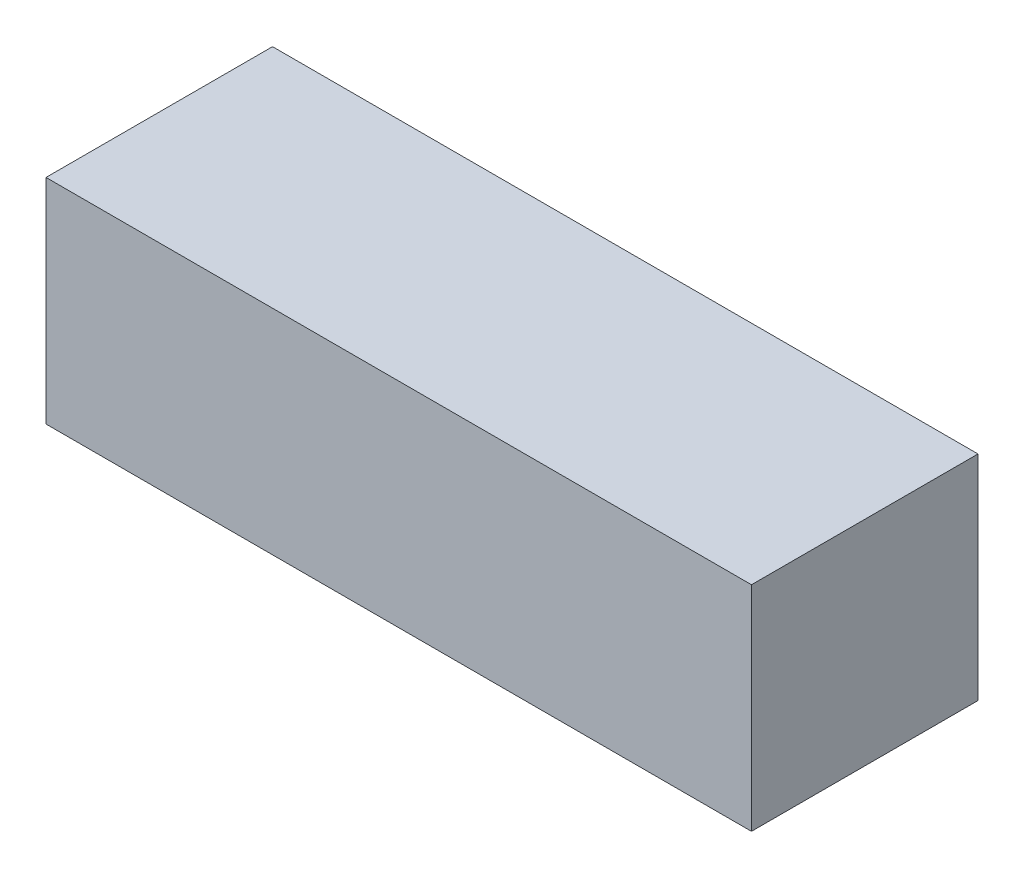
ISO-10303-21;
HEADER;
FILE_DESCRIPTION(('STEP AP214'),'2;1');
FILE_NAME('part.step','',(''),(''),'','','');
FILE_SCHEMA(('AUTOMOTIVE_DESIGN { 1 0 10303 214 1 1 1 1 }'));
ENDSEC;
DATA;
#1=APPLICATION_CONTEXT('core data for automotive mechanical design processes');
#2=APPLICATION_PROTOCOL_DEFINITION('international standard','automotive_design',2000,#1);
#3=PRODUCT_CONTEXT('',#1,'mechanical');
#4=PRODUCT('Part','Part','',(#3));
#5=PRODUCT_RELATED_PRODUCT_CATEGORY('part','',(#4));
#6=PRODUCT_DEFINITION_FORMATION('','',#4);
#7=PRODUCT_DEFINITION_CONTEXT('part definition',#1,'design');
#8=PRODUCT_DEFINITION('design','',#6,#7);
#9=PRODUCT_DEFINITION_SHAPE('','',#8);
#10=(LENGTH_UNIT() NAMED_UNIT(*) SI_UNIT(.MILLI.,.METRE.));
#11=(NAMED_UNIT(*) PLANE_ANGLE_UNIT() SI_UNIT($,.RADIAN.));
#12=(NAMED_UNIT(*) SI_UNIT($,.STERADIAN.) SOLID_ANGLE_UNIT());
#13=UNCERTAINTY_MEASURE_WITH_UNIT(LENGTH_MEASURE(1.E-05),#10,'distance_accuracy_value','');
#14=(GEOMETRIC_REPRESENTATION_CONTEXT(3) GLOBAL_UNCERTAINTY_ASSIGNED_CONTEXT((#13)) GLOBAL_UNIT_ASSIGNED_CONTEXT((#10,
#11,#12)) REPRESENTATION_CONTEXT('',''));
#15=CARTESIAN_POINT('',(0.,0.,0.));
#16=DIRECTION('',(0.,0.,1.));
#17=DIRECTION('',(1.,0.,0.));
#18=AXIS2_PLACEMENT_3D('',#15,#16,#17);
#19=CARTESIAN_POINT('',(54.5,16.5,-17.5));
#20=DIRECTION('',(-1.,0.,0.));
#21=DIRECTION('',(0.,0.,1.));
#22=AXIS2_PLACEMENT_3D('',#19,#20,#21);
#23=PLANE('',#22);
#24=DIRECTION('',(0.,0.,-1.));
#25=VECTOR('',#24,1.);
#26=CARTESIAN_POINT('',(54.5,-16.5,-17.5));
#27=LINE('',#26,#25);
#28=CARTESIAN_POINT('',(54.5,-16.5,17.5));
#29=VERTEX_POINT('',#28);
#30=CARTESIAN_POINT('',(54.5,-16.5,-17.5));
#31=VERTEX_POINT('',#30);
#32=EDGE_CURVE('E95',#29,#31,#27,.T.);
#33=ORIENTED_EDGE('',*,*,#32,.T.);
#34=DIRECTION('',(0.,-1.,0.));
#35=VECTOR('',#34,1.);
#36=CARTESIAN_POINT('',(54.5,16.5,-17.5));
#37=LINE('',#36,#35);
#38=CARTESIAN_POINT('',(54.5,16.5,-17.5));
#39=VERTEX_POINT('',#38);
#40=EDGE_CURVE('E11',#39,#31,#37,.T.);
#41=ORIENTED_EDGE('',*,*,#40,.F.);
#42=DIRECTION('',(0.,0.,-1.));
#43=VECTOR('',#42,1.);
#44=CARTESIAN_POINT('',(54.5,16.5,-17.5));
#45=LINE('',#44,#43);
#46=CARTESIAN_POINT('',(54.5,16.5,17.5));
#47=VERTEX_POINT('',#46);
#48=EDGE_CURVE('E83',#47,#39,#45,.T.);
#49=ORIENTED_EDGE('',*,*,#48,.F.);
#50=DIRECTION('',(0.,-1.,0.));
#51=VECTOR('',#50,1.);
#52=CARTESIAN_POINT('',(54.5,16.5,17.5));
#53=LINE('',#52,#51);
#54=EDGE_CURVE('E91',#47,#29,#53,.T.);
#55=ORIENTED_EDGE('',*,*,#54,.T.);
#56=EDGE_LOOP('',(#33,#41,#49,#55));
#57=FACE_BOUND('',#56,.T.);
#58=ADVANCED_FACE('F32',(#57),#23,.F.);
#59=CARTESIAN_POINT('',(-54.5,16.5,-17.5));
#60=DIRECTION('',(0.,0.,1.));
#61=DIRECTION('',(1.,0.,0.));
#62=AXIS2_PLACEMENT_3D('',#59,#60,#61);
#63=PLANE('',#62);
#64=DIRECTION('',(-1.,0.,0.));
#65=VECTOR('',#64,1.);
#66=CARTESIAN_POINT('',(-54.5,-16.5,-17.5));
#67=LINE('',#66,#65);
#68=CARTESIAN_POINT('',(-54.5,-16.5,-17.5));
#69=VERTEX_POINT('',#68);
#70=EDGE_CURVE('E87',#31,#69,#67,.T.);
#71=ORIENTED_EDGE('',*,*,#70,.T.);
#72=DIRECTION('',(0.,-1.,0.));
#73=VECTOR('',#72,1.);
#74=CARTESIAN_POINT('',(-54.5,16.5,-17.5));
#75=LINE('',#74,#73);
#76=CARTESIAN_POINT('',(-54.5,16.5,-17.5));
#77=VERTEX_POINT('',#76);
#78=EDGE_CURVE('E40',#77,#69,#75,.T.);
#79=ORIENTED_EDGE('',*,*,#78,.F.);
#80=DIRECTION('',(-1.,0.,0.));
#81=VECTOR('',#80,1.);
#82=CARTESIAN_POINT('',(-54.5,16.5,-17.5));
#83=LINE('',#82,#81);
#84=EDGE_CURVE('E78',#39,#77,#83,.T.);
#85=ORIENTED_EDGE('',*,*,#84,.F.);
#86=ORIENTED_EDGE('',*,*,#40,.T.);
#87=EDGE_LOOP('',(#71,#79,#85,#86));
#88=FACE_BOUND('',#87,.T.);
#89=ADVANCED_FACE('F86',(#88),#63,.F.);
#90=CARTESIAN_POINT('',(-54.5,16.5,-17.5));
#91=DIRECTION('',(1.,0.,0.));
#92=DIRECTION('',(0.,0.,-1.));
#93=AXIS2_PLACEMENT_3D('',#90,#91,#92);
#94=PLANE('',#93);
#95=DIRECTION('',(0.,0.,1.));
#96=VECTOR('',#95,1.);
#97=CARTESIAN_POINT('',(-54.5,-16.5,-17.5));
#98=LINE('',#97,#96);
#99=CARTESIAN_POINT('',(-54.5,-16.5,17.5));
#100=VERTEX_POINT('',#99);
#101=EDGE_CURVE('E65',#69,#100,#98,.T.);
#102=ORIENTED_EDGE('',*,*,#101,.T.);
#103=DIRECTION('',(0.,-1.,0.));
#104=VECTOR('',#103,1.);
#105=CARTESIAN_POINT('',(-54.5,16.5,17.5));
#106=LINE('',#105,#104);
#107=CARTESIAN_POINT('',(-54.5,16.5,17.5));
#108=VERTEX_POINT('',#107);
#109=EDGE_CURVE('E88',#108,#100,#106,.T.);
#110=ORIENTED_EDGE('',*,*,#109,.F.);
#111=DIRECTION('',(0.,0.,1.));
#112=VECTOR('',#111,1.);
#113=CARTESIAN_POINT('',(-54.5,16.5,-17.5));
#114=LINE('',#113,#112);
#115=EDGE_CURVE('E81',#77,#108,#114,.T.);
#116=ORIENTED_EDGE('',*,*,#115,.F.);
#117=ORIENTED_EDGE('',*,*,#78,.T.);
#118=EDGE_LOOP('',(#102,#110,#116,#117));
#119=FACE_BOUND('',#118,.T.);
#120=ADVANCED_FACE('F89',(#119),#94,.F.);
#121=CARTESIAN_POINT('',(-54.5,16.5,17.5));
#122=DIRECTION('',(0.,0.,-1.));
#123=DIRECTION('',(-1.,0.,0.));
#124=AXIS2_PLACEMENT_3D('',#121,#122,#123);
#125=PLANE('',#124);
#126=DIRECTION('',(1.,0.,0.));
#127=VECTOR('',#126,1.);
#128=CARTESIAN_POINT('',(-54.5,-16.5,17.5));
#129=LINE('',#128,#127);
#130=EDGE_CURVE('E71',#100,#29,#129,.T.);
#131=ORIENTED_EDGE('',*,*,#130,.T.);
#132=ORIENTED_EDGE('',*,*,#54,.F.);
#133=DIRECTION('',(1.,0.,0.));
#134=VECTOR('',#133,1.);
#135=CARTESIAN_POINT('',(-54.5,16.5,17.5));
#136=LINE('',#135,#134);
#137=EDGE_CURVE('E48',#108,#47,#136,.T.);
#138=ORIENTED_EDGE('',*,*,#137,.F.);
#139=ORIENTED_EDGE('',*,*,#109,.T.);
#140=EDGE_LOOP('',(#131,#132,#138,#139));
#141=FACE_BOUND('',#140,.T.);
#142=ADVANCED_FACE('F102',(#141),#125,.F.);
#143=CARTESIAN_POINT('',(0.,16.5,0.));
#144=DIRECTION('',(0.,1.,0.));
#145=DIRECTION('',(0.,0.,1.));
#146=AXIS2_PLACEMENT_3D('',#143,#144,#145);
#147=PLANE('',#146);
#148=ORIENTED_EDGE('',*,*,#48,.T.);
#149=ORIENTED_EDGE('',*,*,#84,.T.);
#150=ORIENTED_EDGE('',*,*,#115,.T.);
#151=ORIENTED_EDGE('',*,*,#137,.T.);
#152=EDGE_LOOP('',(#148,#149,#150,#151));
#153=FACE_BOUND('',#152,.T.);
#154=ADVANCED_FACE('F79',(#153),#147,.T.);
#155=CARTESIAN_POINT('',(0.,-16.5,0.));
#156=DIRECTION('',(0.,1.,0.));
#157=DIRECTION('',(0.,0.,1.));
#158=AXIS2_PLACEMENT_3D('',#155,#156,#157);
#159=PLANE('',#158);
#160=ORIENTED_EDGE('',*,*,#32,.F.);
#161=ORIENTED_EDGE('',*,*,#130,.F.);
#162=ORIENTED_EDGE('',*,*,#101,.F.);
#163=ORIENTED_EDGE('',*,*,#70,.F.);
#164=EDGE_LOOP('',(#160,#161,#162,#163));
#165=FACE_BOUND('',#164,.T.);
#166=ADVANCED_FACE('F105',(#165),#159,.F.);
#167=CLOSED_SHELL('',(#58,#89,#120,#142,#154,#166));
#168=MANIFOLD_SOLID_BREP('B2',#167);
#169=ADVANCED_BREP_SHAPE_REPRESENTATION('',(#18,#168),#14);
#170=SHAPE_DEFINITION_REPRESENTATION(#9,#169);
ENDSEC;
END-ISO-10303-21;
